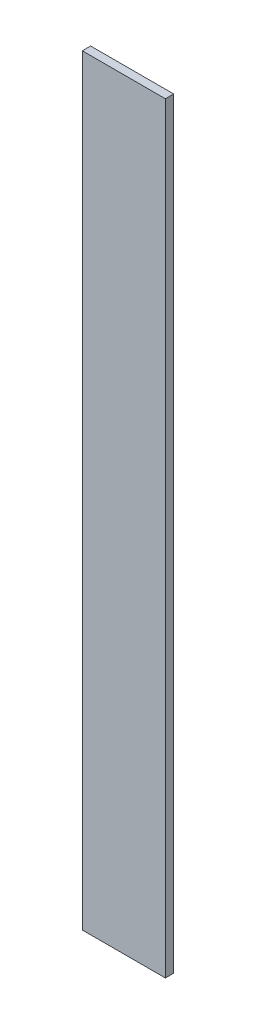
ISO-10303-21;
HEADER;
FILE_DESCRIPTION(('STEP AP214'),'2;1');
FILE_NAME('part.step','',(''),(''),'','','');
FILE_SCHEMA(('AUTOMOTIVE_DESIGN { 1 0 10303 214 1 1 1 1 }'));
ENDSEC;
DATA;
#1=APPLICATION_CONTEXT('core data for automotive mechanical design processes');
#2=APPLICATION_PROTOCOL_DEFINITION('international standard','automotive_design',2000,#1);
#3=PRODUCT_CONTEXT('',#1,'mechanical');
#4=PRODUCT('Part','Part','',(#3));
#5=PRODUCT_RELATED_PRODUCT_CATEGORY('part','',(#4));
#6=PRODUCT_DEFINITION_FORMATION('','',#4);
#7=PRODUCT_DEFINITION_CONTEXT('part definition',#1,'design');
#8=PRODUCT_DEFINITION('design','',#6,#7);
#9=PRODUCT_DEFINITION_SHAPE('','',#8);
#10=(LENGTH_UNIT() NAMED_UNIT(*) SI_UNIT(.MILLI.,.METRE.));
#11=(NAMED_UNIT(*) PLANE_ANGLE_UNIT() SI_UNIT($,.RADIAN.));
#12=(NAMED_UNIT(*) SI_UNIT($,.STERADIAN.) SOLID_ANGLE_UNIT());
#13=UNCERTAINTY_MEASURE_WITH_UNIT(LENGTH_MEASURE(1.E-05),#10,'distance_accuracy_value','');
#14=(GEOMETRIC_REPRESENTATION_CONTEXT(3) GLOBAL_UNCERTAINTY_ASSIGNED_CONTEXT((#13)) GLOBAL_UNIT_ASSIGNED_CONTEXT((#10,
#11,#12)) REPRESENTATION_CONTEXT('',''));
#15=CARTESIAN_POINT('',(0.,0.,0.));
#16=DIRECTION('',(0.,0.,1.));
#17=DIRECTION('',(1.,0.,0.));
#18=AXIS2_PLACEMENT_3D('',#15,#16,#17);
#19=CARTESIAN_POINT('',(15.,137.5,3.));
#20=DIRECTION('',(0.,-1.,0.));
#21=DIRECTION('',(0.,0.,-1.));
#22=AXIS2_PLACEMENT_3D('',#19,#20,#21);
#23=PLANE('',#22);
#24=DIRECTION('',(-1.,0.,0.));
#25=VECTOR('',#24,1.);
#26=CARTESIAN_POINT('',(15.,137.5,0.));
#27=LINE('',#26,#25);
#28=CARTESIAN_POINT('',(15.,137.5,0.));
#29=VERTEX_POINT('',#28);
#30=CARTESIAN_POINT('',(-15.,137.5,0.));
#31=VERTEX_POINT('',#30);
#32=EDGE_CURVE('E105',#29,#31,#27,.T.);
#33=ORIENTED_EDGE('',*,*,#32,.T.);
#34=DIRECTION('',(0.,0.,-1.));
#35=VECTOR('',#34,1.);
#36=CARTESIAN_POINT('',(-15.,137.5,3.));
#37=LINE('',#36,#35);
#38=CARTESIAN_POINT('',(-15.,137.5,3.));
#39=VERTEX_POINT('',#38);
#40=EDGE_CURVE('E11',#39,#31,#37,.T.);
#41=ORIENTED_EDGE('',*,*,#40,.F.);
#42=DIRECTION('',(-1.,0.,0.));
#43=VECTOR('',#42,1.);
#44=CARTESIAN_POINT('',(15.,137.5,3.));
#45=LINE('',#44,#43);
#46=CARTESIAN_POINT('',(15.,137.5,3.));
#47=VERTEX_POINT('',#46);
#48=EDGE_CURVE('E93',#47,#39,#45,.T.);
#49=ORIENTED_EDGE('',*,*,#48,.F.);
#50=DIRECTION('',(0.,0.,-1.));
#51=VECTOR('',#50,1.);
#52=CARTESIAN_POINT('',(15.,137.5,3.));
#53=LINE('',#52,#51);
#54=EDGE_CURVE('E101',#47,#29,#53,.T.);
#55=ORIENTED_EDGE('',*,*,#54,.T.);
#56=EDGE_LOOP('',(#33,#41,#49,#55));
#57=FACE_BOUND('',#56,.T.);
#58=ADVANCED_FACE('F42',(#57),#23,.F.);
#59=CARTESIAN_POINT('',(-15.,-137.5,3.));
#60=DIRECTION('',(1.,0.,0.));
#61=DIRECTION('',(0.,0.,-1.));
#62=AXIS2_PLACEMENT_3D('',#59,#60,#61);
#63=PLANE('',#62);
#64=DIRECTION('',(0.,-1.,0.));
#65=VECTOR('',#64,1.);
#66=CARTESIAN_POINT('',(-15.,-137.5,0.));
#67=LINE('',#66,#65);
#68=CARTESIAN_POINT('',(-15.,-137.5,0.));
#69=VERTEX_POINT('',#68);
#70=EDGE_CURVE('E97',#31,#69,#67,.T.);
#71=ORIENTED_EDGE('',*,*,#70,.T.);
#72=DIRECTION('',(0.,0.,-1.));
#73=VECTOR('',#72,1.);
#74=CARTESIAN_POINT('',(-15.,-137.5,3.));
#75=LINE('',#74,#73);
#76=CARTESIAN_POINT('',(-15.,-137.5,3.));
#77=VERTEX_POINT('',#76);
#78=EDGE_CURVE('E50',#77,#69,#75,.T.);
#79=ORIENTED_EDGE('',*,*,#78,.F.);
#80=DIRECTION('',(0.,-1.,0.));
#81=VECTOR('',#80,1.);
#82=CARTESIAN_POINT('',(-15.,-137.5,3.));
#83=LINE('',#82,#81);
#84=EDGE_CURVE('E88',#39,#77,#83,.T.);
#85=ORIENTED_EDGE('',*,*,#84,.F.);
#86=ORIENTED_EDGE('',*,*,#40,.T.);
#87=EDGE_LOOP('',(#71,#79,#85,#86));
#88=FACE_BOUND('',#87,.T.);
#89=ADVANCED_FACE('F96',(#88),#63,.F.);
#90=CARTESIAN_POINT('',(15.,-137.5,3.));
#91=DIRECTION('',(0.,1.,0.));
#92=DIRECTION('',(0.,0.,1.));
#93=AXIS2_PLACEMENT_3D('',#90,#91,#92);
#94=PLANE('',#93);
#95=DIRECTION('',(1.,0.,0.));
#96=VECTOR('',#95,1.);
#97=CARTESIAN_POINT('',(15.,-137.5,0.));
#98=LINE('',#97,#96);
#99=CARTESIAN_POINT('',(15.,-137.5,0.));
#100=VERTEX_POINT('',#99);
#101=EDGE_CURVE('E75',#69,#100,#98,.T.);
#102=ORIENTED_EDGE('',*,*,#101,.T.);
#103=DIRECTION('',(0.,0.,-1.));
#104=VECTOR('',#103,1.);
#105=CARTESIAN_POINT('',(15.,-137.5,3.));
#106=LINE('',#105,#104);
#107=CARTESIAN_POINT('',(15.,-137.5,3.));
#108=VERTEX_POINT('',#107);
#109=EDGE_CURVE('E98',#108,#100,#106,.T.);
#110=ORIENTED_EDGE('',*,*,#109,.F.);
#111=DIRECTION('',(1.,0.,0.));
#112=VECTOR('',#111,1.);
#113=CARTESIAN_POINT('',(15.,-137.5,3.));
#114=LINE('',#113,#112);
#115=EDGE_CURVE('E91',#77,#108,#114,.T.);
#116=ORIENTED_EDGE('',*,*,#115,.F.);
#117=ORIENTED_EDGE('',*,*,#78,.T.);
#118=EDGE_LOOP('',(#102,#110,#116,#117));
#119=FACE_BOUND('',#118,.T.);
#120=ADVANCED_FACE('F99',(#119),#94,.F.);
#121=CARTESIAN_POINT('',(15.,-137.5,3.));
#122=DIRECTION('',(-1.,0.,0.));
#123=DIRECTION('',(0.,0.,1.));
#124=AXIS2_PLACEMENT_3D('',#121,#122,#123);
#125=PLANE('',#124);
#126=DIRECTION('',(0.,1.,0.));
#127=VECTOR('',#126,1.);
#128=CARTESIAN_POINT('',(15.,-137.5,0.));
#129=LINE('',#128,#127);
#130=EDGE_CURVE('E81',#100,#29,#129,.T.);
#131=ORIENTED_EDGE('',*,*,#130,.T.);
#132=ORIENTED_EDGE('',*,*,#54,.F.);
#133=DIRECTION('',(0.,1.,0.));
#134=VECTOR('',#133,1.);
#135=CARTESIAN_POINT('',(15.,-137.5,3.));
#136=LINE('',#135,#134);
#137=EDGE_CURVE('E58',#108,#47,#136,.T.);
#138=ORIENTED_EDGE('',*,*,#137,.F.);
#139=ORIENTED_EDGE('',*,*,#109,.T.);
#140=EDGE_LOOP('',(#131,#132,#138,#139));
#141=FACE_BOUND('',#140,.T.);
#142=ADVANCED_FACE('F112',(#141),#125,.F.);
#143=CARTESIAN_POINT('',(0.,0.,3.));
#144=DIRECTION('',(0.,0.,-1.));
#145=DIRECTION('',(-1.,0.,0.));
#146=AXIS2_PLACEMENT_3D('',#143,#144,#145);
#147=PLANE('',#146);
#148=ORIENTED_EDGE('',*,*,#48,.T.);
#149=ORIENTED_EDGE('',*,*,#84,.T.);
#150=ORIENTED_EDGE('',*,*,#115,.T.);
#151=ORIENTED_EDGE('',*,*,#137,.T.);
#152=EDGE_LOOP('',(#148,#149,#150,#151));
#153=FACE_BOUND('',#152,.T.);
#154=ADVANCED_FACE('F89',(#153),#147,.F.);
#155=CARTESIAN_POINT('',(0.,0.,0.));
#156=DIRECTION('',(0.,0.,-1.));
#157=DIRECTION('',(-1.,0.,0.));
#158=AXIS2_PLACEMENT_3D('',#155,#156,#157);
#159=PLANE('',#158);
#160=ORIENTED_EDGE('',*,*,#32,.F.);
#161=ORIENTED_EDGE('',*,*,#130,.F.);
#162=ORIENTED_EDGE('',*,*,#101,.F.);
#163=ORIENTED_EDGE('',*,*,#70,.F.);
#164=EDGE_LOOP('',(#160,#161,#162,#163));
#165=FACE_BOUND('',#164,.T.);
#166=ADVANCED_FACE('F115',(#165),#159,.T.);
#167=CLOSED_SHELL('',(#58,#89,#120,#142,#154,#166));
#168=MANIFOLD_SOLID_BREP('B2',#167);
#169=ADVANCED_BREP_SHAPE_REPRESENTATION('',(#18,#168),#14);
#170=SHAPE_DEFINITION_REPRESENTATION(#9,#169);
ENDSEC;
END-ISO-10303-21;
